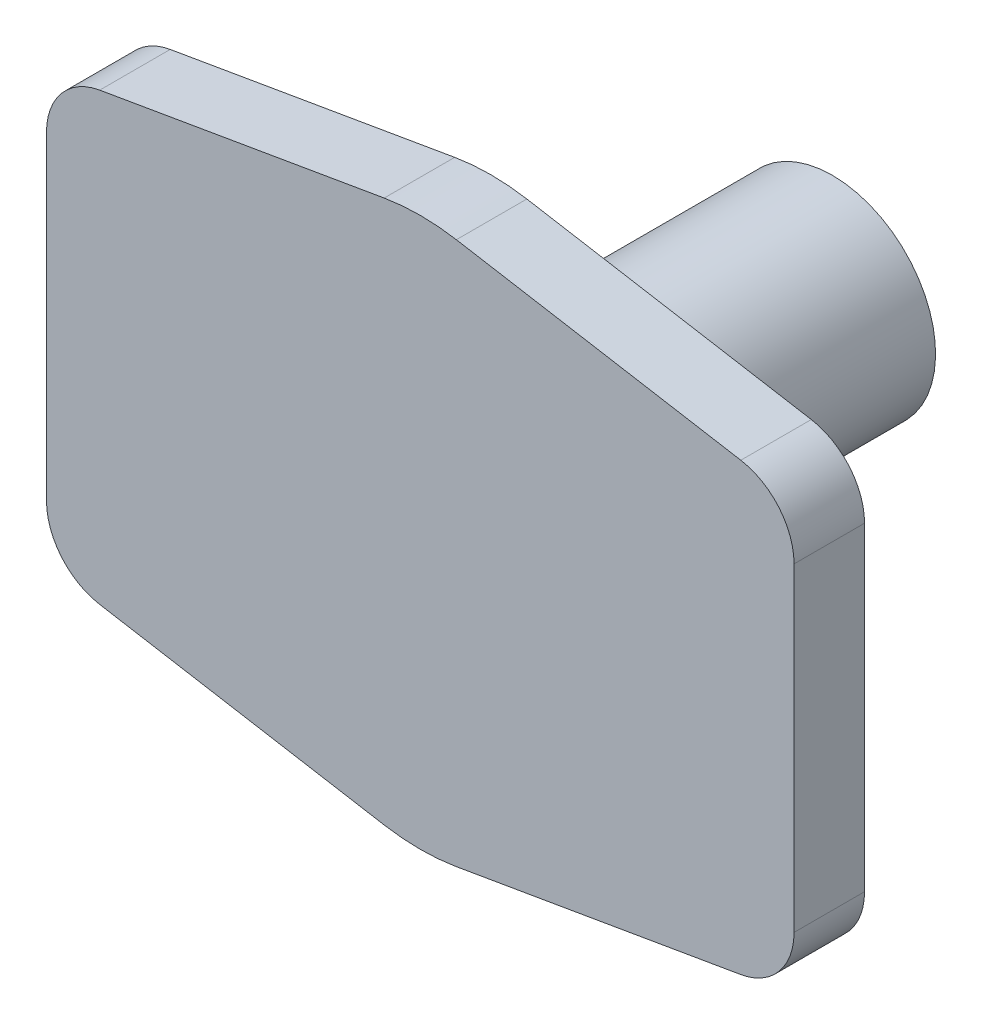
ISO-10303-21;
HEADER;
FILE_DESCRIPTION(('STEP AP214'),'2;1');
FILE_NAME('part.step','',(''),(''),'','','');
FILE_SCHEMA(('AUTOMOTIVE_DESIGN { 1 0 10303 214 1 1 1 1 }'));
ENDSEC;
DATA;
#1=APPLICATION_CONTEXT('core data for automotive mechanical design processes');
#2=APPLICATION_PROTOCOL_DEFINITION('international standard','automotive_design',2000,#1);
#3=PRODUCT_CONTEXT('',#1,'mechanical');
#4=PRODUCT('Part','Part','',(#3));
#5=PRODUCT_RELATED_PRODUCT_CATEGORY('part','',(#4));
#6=PRODUCT_DEFINITION_FORMATION('','',#4);
#7=PRODUCT_DEFINITION_CONTEXT('part definition',#1,'design');
#8=PRODUCT_DEFINITION('design','',#6,#7);
#9=PRODUCT_DEFINITION_SHAPE('','',#8);
#10=(LENGTH_UNIT() NAMED_UNIT(*) SI_UNIT(.MILLI.,.METRE.));
#11=(NAMED_UNIT(*) PLANE_ANGLE_UNIT() SI_UNIT($,.RADIAN.));
#12=(NAMED_UNIT(*) SI_UNIT($,.STERADIAN.) SOLID_ANGLE_UNIT());
#13=UNCERTAINTY_MEASURE_WITH_UNIT(LENGTH_MEASURE(1.E-05),#10,'distance_accuracy_value','');
#14=(GEOMETRIC_REPRESENTATION_CONTEXT(3) GLOBAL_UNCERTAINTY_ASSIGNED_CONTEXT((#13)) GLOBAL_UNIT_ASSIGNED_CONTEXT((#10,
#11,#12)) REPRESENTATION_CONTEXT('',''));
#15=CARTESIAN_POINT('',(0.,0.,0.));
#16=DIRECTION('',(0.,0.,1.));
#17=DIRECTION('',(1.,0.,0.));
#18=AXIS2_PLACEMENT_3D('',#15,#16,#17);
#19=CARTESIAN_POINT('',(0.,0.,-5.));
#20=DIRECTION('',(0.,0.,1.));
#21=DIRECTION('',(1.,0.,0.));
#22=AXIS2_PLACEMENT_3D('',#19,#20,#21);
#23=CYLINDRICAL_SURFACE('',#22,6.82);
#24=CARTESIAN_POINT('',(0.,0.,-1.9));
#25=DIRECTION('',(0.,0.,-1.));
#26=DIRECTION('',(-1.,0.,0.));
#27=AXIS2_PLACEMENT_3D('',#24,#25,#26);
#28=CIRCLE('',#27,6.82);
#29=CARTESIAN_POINT('',(-6.82,0.,-1.9));
#30=VERTEX_POINT('',#29);
#31=EDGE_CURVE('E259',#30,#30,#28,.F.);
#32=ORIENTED_EDGE('',*,*,#31,.F.);
#33=EDGE_LOOP('',(#32));
#34=FACE_BOUND('',#33,.T.);
#35=CARTESIAN_POINT('',(0.,0.,-5.));
#36=DIRECTION('',(0.,0.,1.));
#37=DIRECTION('',(0.,1.,0.));
#38=AXIS2_PLACEMENT_3D('',#35,#36,#37);
#39=CIRCLE('',#38,6.82);
#40=CARTESIAN_POINT('',(0.,6.82,-5.));
#41=VERTEX_POINT('',#40);
#42=EDGE_CURVE('E190',#41,#41,#39,.T.);
#43=ORIENTED_EDGE('',*,*,#42,.T.);
#44=EDGE_LOOP('',(#43));
#45=FACE_BOUND('',#44,.T.);
#46=ADVANCED_FACE('F15',(#34,#45),#23,.T.);
#47=CARTESIAN_POINT('',(0.,0.,-5.));
#48=DIRECTION('',(0.,0.,1.));
#49=DIRECTION('',(1.,0.,0.));
#50=AXIS2_PLACEMENT_3D('',#47,#48,#49);
#51=PLANE('',#50);
#52=CARTESIAN_POINT('',(0.,0.,-5.));
#53=DIRECTION('',(0.,0.,1.));
#54=DIRECTION('',(0.,1.,0.));
#55=AXIS2_PLACEMENT_3D('',#52,#53,#54);
#56=CIRCLE('',#55,4.825);
#57=CARTESIAN_POINT('',(0.,4.825,-5.));
#58=VERTEX_POINT('',#57);
#59=EDGE_CURVE('E324',#58,#58,#56,.T.);
#60=ORIENTED_EDGE('',*,*,#59,.T.);
#61=EDGE_LOOP('',(#60));
#62=FACE_BOUND('',#61,.T.);
#63=ORIENTED_EDGE('',*,*,#42,.F.);
#64=EDGE_LOOP('',(#63));
#65=FACE_BOUND('',#64,.T.);
#66=ADVANCED_FACE('F335',(#62,#65),#51,.F.);
#67=CARTESIAN_POINT('',(0.,0.,-16.));
#68=DIRECTION('',(0.,0.,1.));
#69=DIRECTION('',(1.,0.,0.));
#70=AXIS2_PLACEMENT_3D('',#67,#68,#69);
#71=CYLINDRICAL_SURFACE('',#70,4.825);
#72=CARTESIAN_POINT('',(0.,0.,-16.));
#73=DIRECTION('',(0.,0.,1.));
#74=DIRECTION('',(0.,1.,0.));
#75=AXIS2_PLACEMENT_3D('',#72,#73,#74);
#76=CIRCLE('',#75,4.825);
#77=CARTESIAN_POINT('',(0.,4.825,-16.));
#78=VERTEX_POINT('',#77);
#79=EDGE_CURVE('E459',#78,#78,#76,.T.);
#80=ORIENTED_EDGE('',*,*,#79,.T.);
#81=EDGE_LOOP('',(#80));
#82=FACE_BOUND('',#81,.T.);
#83=ORIENTED_EDGE('',*,*,#59,.F.);
#84=EDGE_LOOP('',(#83));
#85=FACE_BOUND('',#84,.T.);
#86=ADVANCED_FACE('F341',(#82,#85),#71,.T.);
#87=CARTESIAN_POINT('',(0.,0.,-16.));
#88=DIRECTION('',(0.,0.,1.));
#89=DIRECTION('',(1.,0.,0.));
#90=AXIS2_PLACEMENT_3D('',#87,#88,#89);
#91=PLANE('',#90);
#92=ORIENTED_EDGE('',*,*,#79,.F.);
#93=EDGE_LOOP('',(#92));
#94=FACE_BOUND('',#93,.T.);
#95=ADVANCED_FACE('F548',(#94),#91,.F.);
#96=CARTESIAN_POINT('',(7.,4.04145188432735,-1.9));
#97=DIRECTION('',(-1.,0.,0.));
#98=DIRECTION('',(0.,-1.,0.));
#99=AXIS2_PLACEMENT_3D('',#96,#97,#98);
#100=PLANE('',#99);
#101=DIRECTION('',(0.,-1.,0.));
#102=VECTOR('',#101,1.);
#103=CARTESIAN_POINT('',(7.,4.04145188432735,0.));
#104=LINE('',#103,#102);
#105=CARTESIAN_POINT('',(7.,3.40059308552686,0.));
#106=VERTEX_POINT('',#105);
#107=CARTESIAN_POINT('',(7.,-3.4005930855269,0.));
#108=VERTEX_POINT('',#107);
#109=EDGE_CURVE('E444',#106,#108,#104,.T.);
#110=ORIENTED_EDGE('',*,*,#109,.T.);
#111=DIRECTION('',(0.,0.,1.));
#112=VECTOR('',#111,1.);
#113=CARTESIAN_POINT('',(7.,-3.4005930855269,-1.9));
#114=LINE('',#113,#112);
#115=CARTESIAN_POINT('',(7.,-3.4005930855269,-1.9));
#116=VERTEX_POINT('',#115);
#117=EDGE_CURVE('E276',#108,#116,#114,.F.);
#118=ORIENTED_EDGE('',*,*,#117,.T.);
#119=DIRECTION('',(0.,-1.,0.));
#120=VECTOR('',#119,1.);
#121=CARTESIAN_POINT('',(7.,4.04145188432735,-1.9));
#122=LINE('',#121,#120);
#123=CARTESIAN_POINT('',(7.,3.40059308552686,-1.9));
#124=VERTEX_POINT('',#123);
#125=EDGE_CURVE('E435',#124,#116,#122,.T.);
#126=ORIENTED_EDGE('',*,*,#125,.F.);
#127=DIRECTION('',(0.,0.,1.));
#128=VECTOR('',#127,1.);
#129=CARTESIAN_POINT('',(7.,3.40059308552686,-1.9));
#130=LINE('',#129,#128);
#131=EDGE_CURVE('E262',#124,#106,#130,.T.);
#132=ORIENTED_EDGE('',*,*,#131,.T.);
#133=EDGE_LOOP('',(#110,#118,#126,#132));
#134=FACE_BOUND('',#133,.T.);
#135=ADVANCED_FACE('F545',(#134),#100,.F.);
#136=CARTESIAN_POINT('',(7.,-4.04145188432738,-1.9));
#137=DIRECTION('',(-0.5,0.866025403784439,0.));
#138=DIRECTION('',(-0.866025403784439,-0.5,0.));
#139=AXIS2_PLACEMENT_3D('',#136,#137,#138);
#140=PLANE('',#139);
#141=DIRECTION('',(-0.866025403784439,-0.5,0.));
#142=VECTOR('',#141,1.);
#143=CARTESIAN_POINT('',(7.,-4.04145188432738,0.));
#144=LINE('',#143,#142);
#145=CARTESIAN_POINT('',(6.445,-4.36188128372763,0.));
#146=VERTEX_POINT('',#145);
#147=CARTESIAN_POINT('',(0.555,-7.76247436925452,0.));
#148=VERTEX_POINT('',#147);
#149=EDGE_CURVE('E439',#146,#148,#144,.T.);
#150=ORIENTED_EDGE('',*,*,#149,.T.);
#151=DIRECTION('',(0.,0.,1.));
#152=VECTOR('',#151,1.);
#153=CARTESIAN_POINT('',(0.555,-7.76247436925452,-1.9));
#154=LINE('',#153,#152);
#155=CARTESIAN_POINT('',(0.555,-7.76247436925452,-1.9));
#156=VERTEX_POINT('',#155);
#157=EDGE_CURVE('E285',#148,#156,#154,.F.);
#158=ORIENTED_EDGE('',*,*,#157,.T.);
#159=DIRECTION('',(-0.866025403784439,-0.5,0.));
#160=VECTOR('',#159,1.);
#161=CARTESIAN_POINT('',(7.,-4.04145188432738,-1.9));
#162=LINE('',#161,#160);
#163=CARTESIAN_POINT('',(6.445,-4.36188128372763,-1.9));
#164=VERTEX_POINT('',#163);
#165=EDGE_CURVE('E431',#164,#156,#162,.T.);
#166=ORIENTED_EDGE('',*,*,#165,.F.);
#167=DIRECTION('',(0.,0.,1.));
#168=VECTOR('',#167,1.);
#169=CARTESIAN_POINT('',(6.445,-4.36188128372763,-1.9));
#170=LINE('',#169,#168);
#171=EDGE_CURVE('E273',#164,#146,#170,.T.);
#172=ORIENTED_EDGE('',*,*,#171,.T.);
#173=EDGE_LOOP('',(#150,#158,#166,#172));
#174=FACE_BOUND('',#173,.T.);
#175=ADVANCED_FACE('F521',(#174),#140,.F.);
#176=CARTESIAN_POINT('',(0.,-8.08290376865476,-1.9));
#177=DIRECTION('',(0.5,0.866025403784438,0.));
#178=DIRECTION('',(-0.866025403784439,0.5,0.));
#179=AXIS2_PLACEMENT_3D('',#176,#177,#178);
#180=PLANE('',#179);
#181=DIRECTION('',(-0.866025403784438,0.5,0.));
#182=VECTOR('',#181,1.);
#183=CARTESIAN_POINT('',(0.,-8.08290376865476,0.));
#184=LINE('',#183,#182);
#185=CARTESIAN_POINT('',(-0.555,-7.76247436925452,0.));
#186=VERTEX_POINT('',#185);
#187=CARTESIAN_POINT('',(-6.445,-4.36188128372762,0.));
#188=VERTEX_POINT('',#187);
#189=EDGE_CURVE('E443',#186,#188,#184,.T.);
#190=ORIENTED_EDGE('',*,*,#189,.T.);
#191=DIRECTION('',(0.,0.,1.));
#192=VECTOR('',#191,1.);
#193=CARTESIAN_POINT('',(-6.445,-4.36188128372762,-1.9));
#194=LINE('',#193,#192);
#195=CARTESIAN_POINT('',(-6.445,-4.36188128372762,-1.9));
#196=VERTEX_POINT('',#195);
#197=EDGE_CURVE('E294',#188,#196,#194,.F.);
#198=ORIENTED_EDGE('',*,*,#197,.T.);
#199=DIRECTION('',(-0.866025403784438,0.5,0.));
#200=VECTOR('',#199,1.);
#201=CARTESIAN_POINT('',(0.,-8.08290376865476,-1.9));
#202=LINE('',#201,#200);
#203=CARTESIAN_POINT('',(-0.555,-7.76247436925452,-1.9));
#204=VERTEX_POINT('',#203);
#205=EDGE_CURVE('E423',#204,#196,#202,.T.);
#206=ORIENTED_EDGE('',*,*,#205,.F.);
#207=DIRECTION('',(0.,0.,1.));
#208=VECTOR('',#207,1.);
#209=CARTESIAN_POINT('',(-0.555,-7.76247436925452,-1.9));
#210=LINE('',#209,#208);
#211=EDGE_CURVE('E282',#204,#186,#210,.T.);
#212=ORIENTED_EDGE('',*,*,#211,.T.);
#213=EDGE_LOOP('',(#190,#198,#206,#212));
#214=FACE_BOUND('',#213,.T.);
#215=ADVANCED_FACE('F528',(#214),#180,.F.);
#216=CARTESIAN_POINT('',(-7.,-4.04145188432738,-1.9));
#217=DIRECTION('',(1.,0.,0.));
#218=DIRECTION('',(0.,1.,0.));
#219=AXIS2_PLACEMENT_3D('',#216,#217,#218);
#220=PLANE('',#219);
#221=DIRECTION('',(0.,1.,0.));
#222=VECTOR('',#221,1.);
#223=CARTESIAN_POINT('',(-7.,-4.04145188432738,0.));
#224=LINE('',#223,#222);
#225=CARTESIAN_POINT('',(-7.,-3.40059308552689,0.));
#226=VERTEX_POINT('',#225);
#227=CARTESIAN_POINT('',(-7.,3.4005930855269,0.));
#228=VERTEX_POINT('',#227);
#229=EDGE_CURVE('E448',#226,#228,#224,.T.);
#230=ORIENTED_EDGE('',*,*,#229,.T.);
#231=DIRECTION('',(0.,0.,1.));
#232=VECTOR('',#231,1.);
#233=CARTESIAN_POINT('',(-7.,3.4005930855269,-1.9));
#234=LINE('',#233,#232);
#235=CARTESIAN_POINT('',(-7.,3.4005930855269,-1.9));
#236=VERTEX_POINT('',#235);
#237=EDGE_CURVE('E303',#228,#236,#234,.F.);
#238=ORIENTED_EDGE('',*,*,#237,.T.);
#239=DIRECTION('',(0.,1.,0.));
#240=VECTOR('',#239,1.);
#241=CARTESIAN_POINT('',(-7.,-4.04145188432738,-1.9));
#242=LINE('',#241,#240);
#243=CARTESIAN_POINT('',(-7.,-3.40059308552689,-1.9));
#244=VERTEX_POINT('',#243);
#245=EDGE_CURVE('E420',#244,#236,#242,.T.);
#246=ORIENTED_EDGE('',*,*,#245,.F.);
#247=DIRECTION('',(0.,0.,1.));
#248=VECTOR('',#247,1.);
#249=CARTESIAN_POINT('',(-7.,-3.40059308552689,-1.9));
#250=LINE('',#249,#248);
#251=EDGE_CURVE('E291',#244,#226,#250,.T.);
#252=ORIENTED_EDGE('',*,*,#251,.T.);
#253=EDGE_LOOP('',(#230,#238,#246,#252));
#254=FACE_BOUND('',#253,.T.);
#255=ADVANCED_FACE('F426',(#254),#220,.F.);
#256=CARTESIAN_POINT('',(-7.,4.04145188432738,-1.9));
#257=DIRECTION('',(0.5,-0.86602540378444,0.));
#258=DIRECTION('',(0.86602540378444,0.5,0.));
#259=AXIS2_PLACEMENT_3D('',#256,#257,#258);
#260=PLANE('',#259);
#261=DIRECTION('',(0.86602540378444,0.5,0.));
#262=VECTOR('',#261,1.);
#263=CARTESIAN_POINT('',(-7.,4.04145188432738,0.));
#264=LINE('',#263,#262);
#265=CARTESIAN_POINT('',(-6.445,4.36188128372763,0.));
#266=VERTEX_POINT('',#265);
#267=CARTESIAN_POINT('',(-0.55499999999998,7.76247436925451,0.));
#268=VERTEX_POINT('',#267);
#269=EDGE_CURVE('E451',#266,#268,#264,.T.);
#270=ORIENTED_EDGE('',*,*,#269,.T.);
#271=DIRECTION('',(0.,0.,1.));
#272=VECTOR('',#271,1.);
#273=CARTESIAN_POINT('',(-0.554999999999979,7.76247436925451,-1.9));
#274=LINE('',#273,#272);
#275=CARTESIAN_POINT('',(-0.55499999999998,7.76247436925451,-1.9));
#276=VERTEX_POINT('',#275);
#277=EDGE_CURVE('E35',#268,#276,#274,.F.);
#278=ORIENTED_EDGE('',*,*,#277,.T.);
#279=DIRECTION('',(0.86602540378444,0.5,0.));
#280=VECTOR('',#279,1.);
#281=CARTESIAN_POINT('',(-7.,4.04145188432738,-1.9));
#282=LINE('',#281,#280);
#283=CARTESIAN_POINT('',(-6.445,4.36188128372763,-1.9));
#284=VERTEX_POINT('',#283);
#285=EDGE_CURVE('E317',#284,#276,#282,.T.);
#286=ORIENTED_EDGE('',*,*,#285,.F.);
#287=DIRECTION('',(0.,0.,1.));
#288=VECTOR('',#287,1.);
#289=CARTESIAN_POINT('',(-6.445,4.36188128372763,-1.9));
#290=LINE('',#289,#288);
#291=EDGE_CURVE('E300',#284,#266,#290,.T.);
#292=ORIENTED_EDGE('',*,*,#291,.T.);
#293=EDGE_LOOP('',(#270,#278,#286,#292));
#294=FACE_BOUND('',#293,.T.);
#295=ADVANCED_FACE('F530',(#294),#260,.F.);
#296=CARTESIAN_POINT('',(0.,8.08290376865475,-1.9));
#297=DIRECTION('',(-0.5,-0.866025403784437,0.));
#298=DIRECTION('',(0.866025403784437,-0.5,0.));
#299=AXIS2_PLACEMENT_3D('',#296,#297,#298);
#300=PLANE('',#299);
#301=DIRECTION('',(0.866025403784437,-0.5,0.));
#302=VECTOR('',#301,1.);
#303=CARTESIAN_POINT('',(0.,8.08290376865475,-1.9));
#304=LINE('',#303,#302);
#305=CARTESIAN_POINT('',(0.555000000000021,7.76247436925451,-1.9));
#306=VERTEX_POINT('',#305);
#307=CARTESIAN_POINT('',(6.445,4.36188128372759,-1.9));
#308=VERTEX_POINT('',#307);
#309=EDGE_CURVE('E316',#306,#308,#304,.T.);
#310=ORIENTED_EDGE('',*,*,#309,.F.);
#311=DIRECTION('',(0.,0.,1.));
#312=VECTOR('',#311,1.);
#313=CARTESIAN_POINT('',(0.555000000000021,7.76247436925451,-1.9));
#314=LINE('',#313,#312);
#315=CARTESIAN_POINT('',(0.555000000000021,7.76247436925451,0.));
#316=VERTEX_POINT('',#315);
#317=EDGE_CURVE('E309',#306,#316,#314,.T.);
#318=ORIENTED_EDGE('',*,*,#317,.T.);
#319=DIRECTION('',(0.866025403784437,-0.5,0.));
#320=VECTOR('',#319,1.);
#321=CARTESIAN_POINT('',(0.,8.08290376865475,0.));
#322=LINE('',#321,#320);
#323=CARTESIAN_POINT('',(6.445,4.36188128372759,0.));
#324=VERTEX_POINT('',#323);
#325=EDGE_CURVE('E438',#316,#324,#322,.T.);
#326=ORIENTED_EDGE('',*,*,#325,.T.);
#327=DIRECTION('',(0.,0.,1.));
#328=VECTOR('',#327,1.);
#329=CARTESIAN_POINT('',(6.445,4.36188128372759,-1.9));
#330=LINE('',#329,#328);
#331=EDGE_CURVE('E265',#324,#308,#330,.F.);
#332=ORIENTED_EDGE('',*,*,#331,.T.);
#333=EDGE_LOOP('',(#310,#318,#326,#332));
#334=FACE_BOUND('',#333,.T.);
#335=ADVANCED_FACE('F321',(#334),#300,.F.);
#336=CARTESIAN_POINT('',(0.,0.,-1.9));
#337=DIRECTION('',(0.,0.,-1.));
#338=DIRECTION('',(-1.,0.,0.));
#339=AXIS2_PLACEMENT_3D('',#336,#337,#338);
#340=PLANE('',#339);
#341=ORIENTED_EDGE('',*,*,#31,.T.);
#342=EDGE_LOOP('',(#341));
#343=FACE_BOUND('',#342,.T.);
#344=ORIENTED_EDGE('',*,*,#285,.T.);
#345=CARTESIAN_POINT('',(0.,6.80118617105378,-1.9));
#346=DIRECTION('',(0.,0.,-1.));
#347=DIRECTION('',(-1.,0.,0.));
#348=AXIS2_PLACEMENT_3D('',#345,#346,#347);
#349=CIRCLE('',#348,1.11);
#350=EDGE_CURVE('E23',#276,#306,#349,.T.);
#351=ORIENTED_EDGE('',*,*,#350,.T.);
#352=ORIENTED_EDGE('',*,*,#309,.T.);
#353=CARTESIAN_POINT('',(5.89,3.40059308552687,-1.9));
#354=DIRECTION('',(0.,0.,-1.));
#355=DIRECTION('',(-1.,0.,0.));
#356=AXIS2_PLACEMENT_3D('',#353,#354,#355);
#357=CIRCLE('',#356,1.11);
#358=EDGE_CURVE('E268',#308,#124,#357,.T.);
#359=ORIENTED_EDGE('',*,*,#358,.T.);
#360=ORIENTED_EDGE('',*,*,#125,.T.);
#361=CARTESIAN_POINT('',(5.89,-3.4005930855269,-1.9));
#362=DIRECTION('',(0.,0.,-1.));
#363=DIRECTION('',(-1.,0.,0.));
#364=AXIS2_PLACEMENT_3D('',#361,#362,#363);
#365=CIRCLE('',#364,1.11);
#366=EDGE_CURVE('E278',#116,#164,#365,.T.);
#367=ORIENTED_EDGE('',*,*,#366,.T.);
#368=ORIENTED_EDGE('',*,*,#165,.T.);
#369=CARTESIAN_POINT('',(0.,-6.80118617105379,-1.9));
#370=DIRECTION('',(0.,0.,-1.));
#371=DIRECTION('',(-1.,0.,0.));
#372=AXIS2_PLACEMENT_3D('',#369,#370,#371);
#373=CIRCLE('',#372,1.11);
#374=EDGE_CURVE('E287',#156,#204,#373,.T.);
#375=ORIENTED_EDGE('',*,*,#374,.T.);
#376=ORIENTED_EDGE('',*,*,#205,.T.);
#377=CARTESIAN_POINT('',(-5.89,-3.40059308552689,-1.9));
#378=DIRECTION('',(0.,0.,-1.));
#379=DIRECTION('',(-1.,0.,0.));
#380=AXIS2_PLACEMENT_3D('',#377,#378,#379);
#381=CIRCLE('',#380,1.11);
#382=EDGE_CURVE('E296',#196,#244,#381,.T.);
#383=ORIENTED_EDGE('',*,*,#382,.T.);
#384=ORIENTED_EDGE('',*,*,#245,.T.);
#385=CARTESIAN_POINT('',(-5.89,3.4005930855269,-1.9));
#386=DIRECTION('',(0.,0.,-1.));
#387=DIRECTION('',(-1.,0.,0.));
#388=AXIS2_PLACEMENT_3D('',#385,#386,#387);
#389=CIRCLE('',#388,1.11);
#390=EDGE_CURVE('E305',#236,#284,#389,.T.);
#391=ORIENTED_EDGE('',*,*,#390,.T.);
#392=EDGE_LOOP('',(#344,#351,#352,#359,#360,#367,#368,#375,#376,#383,#384,#391));
#393=FACE_BOUND('',#392,.T.);
#394=ADVANCED_FACE('F315',(#343,#393),#340,.T.);
#395=CARTESIAN_POINT('',(0.,0.,3.3));
#396=DIRECTION('',(0.,0.,-1.));
#397=DIRECTION('',(-1.,0.,0.));
#398=AXIS2_PLACEMENT_3D('',#395,#396,#397);
#399=PLANE('',#398);
#400=DIRECTION('',(-0.985622254813267,0.168963815110846,0.));
#401=VECTOR('',#400,1.);
#402=CARTESIAN_POINT('',(17.5,10.,3.3));
#403=LINE('',#402,#401);
#404=CARTESIAN_POINT('',(15.0068914453326,10.427390037943,3.3));
#405=VERTEX_POINT('',#404);
#406=CARTESIAN_POINT('',(1.68963815110846,12.7103477455243,3.3));
#407=VERTEX_POINT('',#406);
#408=EDGE_CURVE('E472',#405,#407,#403,.T.);
#409=ORIENTED_EDGE('',*,*,#408,.T.);
#410=CARTESIAN_POINT('',(0.,2.8541251973916,3.3));
#411=DIRECTION('',(0.,0.,-1.));
#412=DIRECTION('',(-1.,0.,0.));
#413=AXIS2_PLACEMENT_3D('',#410,#411,#412);
#414=CIRCLE('',#413,10.);
#415=CARTESIAN_POINT('',(-1.68963815110846,12.7103477455243,3.3));
#416=VERTEX_POINT('',#415);
#417=EDGE_CURVE('E253',#407,#416,#414,.F.);
#418=ORIENTED_EDGE('',*,*,#417,.T.);
#419=DIRECTION('',(-0.985622254813267,-0.168963815110846,0.));
#420=VECTOR('',#419,1.);
#421=CARTESIAN_POINT('',(0.,13.,3.3));
#422=LINE('',#421,#420);
#423=CARTESIAN_POINT('',(-15.0068914453326,10.427390037943,3.3));
#424=VERTEX_POINT('',#423);
#425=EDGE_CURVE('E475',#416,#424,#422,.T.);
#426=ORIENTED_EDGE('',*,*,#425,.T.);
#427=CARTESIAN_POINT('',(-14.5,7.47052327350319,3.3));
#428=DIRECTION('',(0.,0.,-1.));
#429=DIRECTION('',(-1.,0.,0.));
#430=AXIS2_PLACEMENT_3D('',#427,#428,#429);
#431=CIRCLE('',#430,3.);
#432=CARTESIAN_POINT('',(-17.5,7.47052327350319,3.3));
#433=VERTEX_POINT('',#432);
#434=EDGE_CURVE('E226',#424,#433,#431,.F.);
#435=ORIENTED_EDGE('',*,*,#434,.T.);
#436=DIRECTION('',(0.,1.,0.));
#437=VECTOR('',#436,1.);
#438=CARTESIAN_POINT('',(-17.5,-13.,3.3));
#439=LINE('',#438,#437);
#440=CARTESIAN_POINT('',(-17.5,-7.47052327350319,3.3));
#441=VERTEX_POINT('',#440);
#442=EDGE_CURVE('E479',#441,#433,#439,.T.);
#443=ORIENTED_EDGE('',*,*,#442,.F.);
#444=CARTESIAN_POINT('',(-14.5,-7.47052327350319,3.3));
#445=DIRECTION('',(0.,0.,-1.));
#446=DIRECTION('',(-1.,0.,0.));
#447=AXIS2_PLACEMENT_3D('',#444,#445,#446);
#448=CIRCLE('',#447,3.);
#449=CARTESIAN_POINT('',(-15.0068914453326,-10.427390037943,3.3));
#450=VERTEX_POINT('',#449);
#451=EDGE_CURVE('E216',#441,#450,#448,.F.);
#452=ORIENTED_EDGE('',*,*,#451,.T.);
#453=DIRECTION('',(0.985622254813267,-0.168963815110846,0.));
#454=VECTOR('',#453,1.);
#455=CARTESIAN_POINT('',(-17.5,-10.,3.3));
#456=LINE('',#455,#454);
#457=CARTESIAN_POINT('',(-1.68963815110846,-12.7103477455243,3.3));
#458=VERTEX_POINT('',#457);
#459=EDGE_CURVE('E189',#450,#458,#456,.T.);
#460=ORIENTED_EDGE('',*,*,#459,.T.);
#461=CARTESIAN_POINT('',(0.,-2.8541251973916,3.3));
#462=DIRECTION('',(0.,0.,-1.));
#463=DIRECTION('',(-1.,0.,0.));
#464=AXIS2_PLACEMENT_3D('',#461,#462,#463);
#465=CIRCLE('',#464,10.);
#466=CARTESIAN_POINT('',(1.68963815110846,-12.7103477455243,3.3));
#467=VERTEX_POINT('',#466);
#468=EDGE_CURVE('E184',#458,#467,#465,.F.);
#469=ORIENTED_EDGE('',*,*,#468,.T.);
#470=DIRECTION('',(0.985622254813267,0.168963815110846,0.));
#471=VECTOR('',#470,1.);
#472=CARTESIAN_POINT('',(0.,-13.,3.3));
#473=LINE('',#472,#471);
#474=CARTESIAN_POINT('',(15.0068914453326,-10.427390037943,3.3));
#475=VERTEX_POINT('',#474);
#476=EDGE_CURVE('E176',#467,#475,#473,.T.);
#477=ORIENTED_EDGE('',*,*,#476,.T.);
#478=CARTESIAN_POINT('',(14.5,-7.47052327350319,3.3));
#479=DIRECTION('',(0.,0.,-1.));
#480=DIRECTION('',(-1.,0.,0.));
#481=AXIS2_PLACEMENT_3D('',#478,#479,#480);
#482=CIRCLE('',#481,3.);
#483=CARTESIAN_POINT('',(17.5,-7.47052327350319,3.3));
#484=VERTEX_POINT('',#483);
#485=EDGE_CURVE('E181',#475,#484,#482,.F.);
#486=ORIENTED_EDGE('',*,*,#485,.T.);
#487=DIRECTION('',(0.,-1.,0.));
#488=VECTOR('',#487,1.);
#489=CARTESIAN_POINT('',(17.5,13.,3.3));
#490=LINE('',#489,#488);
#491=CARTESIAN_POINT('',(17.5,7.47052327350319,3.3));
#492=VERTEX_POINT('',#491);
#493=EDGE_CURVE('E482',#492,#484,#490,.T.);
#494=ORIENTED_EDGE('',*,*,#493,.F.);
#495=CARTESIAN_POINT('',(14.5,7.47052327350319,3.3));
#496=DIRECTION('',(0.,0.,-1.));
#497=DIRECTION('',(-1.,0.,0.));
#498=AXIS2_PLACEMENT_3D('',#495,#496,#497);
#499=CIRCLE('',#498,3.);
#500=EDGE_CURVE('E235',#492,#405,#499,.F.);
#501=ORIENTED_EDGE('',*,*,#500,.T.);
#502=EDGE_LOOP('',(#409,#418,#426,#435,#443,#452,#460,#469,#477,#486,#494,#501));
#503=FACE_BOUND('',#502,.T.);
#504=ADVANCED_FACE('F179',(#503),#399,.F.);
#505=CARTESIAN_POINT('',(-14.5,7.47052327350319,-41.6431863578897));
#506=DIRECTION('',(0.,0.,1.));
#507=DIRECTION('',(1.,0.,0.));
#508=AXIS2_PLACEMENT_3D('',#505,#506,#507);
#509=CYLINDRICAL_SURFACE('',#508,3.);
#510=CARTESIAN_POINT('',(-14.5,7.47052327350319,0.));
#511=DIRECTION('',(0.,0.,-1.));
#512=DIRECTION('',(-1.,0.,0.));
#513=AXIS2_PLACEMENT_3D('',#510,#511,#512);
#514=CIRCLE('',#513,3.);
#515=CARTESIAN_POINT('',(-17.5,7.47052327350319,0.));
#516=VERTEX_POINT('',#515);
#517=CARTESIAN_POINT('',(-15.0068914453326,10.427390037943,0.));
#518=VERTEX_POINT('',#517);
#519=EDGE_CURVE('E230',#516,#518,#514,.T.);
#520=ORIENTED_EDGE('',*,*,#519,.F.);
#521=DIRECTION('',(0.,0.,1.));
#522=VECTOR('',#521,1.);
#523=CARTESIAN_POINT('',(-17.5,7.47052327350319,3.3));
#524=LINE('',#523,#522);
#525=EDGE_CURVE('E228',#433,#516,#524,.F.);
#526=ORIENTED_EDGE('',*,*,#525,.F.);
#527=ORIENTED_EDGE('',*,*,#434,.F.);
#528=DIRECTION('',(0.,0.,1.));
#529=VECTOR('',#528,1.);
#530=CARTESIAN_POINT('',(-15.0068914453326,10.427390037943,-41.6431863578897));
#531=LINE('',#530,#529);
#532=EDGE_CURVE('E223',#518,#424,#531,.T.);
#533=ORIENTED_EDGE('',*,*,#532,.F.);
#534=EDGE_LOOP('',(#520,#526,#527,#533));
#535=FACE_BOUND('',#534,.T.);
#536=ADVANCED_FACE('F369',(#535),#509,.T.);
#537=CARTESIAN_POINT('',(-17.5,-13.,3.3));
#538=DIRECTION('',(-1.,0.,0.));
#539=DIRECTION('',(0.,0.,1.));
#540=AXIS2_PLACEMENT_3D('',#537,#538,#539);
#541=PLANE('',#540);
#542=ORIENTED_EDGE('',*,*,#442,.T.);
#543=ORIENTED_EDGE('',*,*,#525,.T.);
#544=DIRECTION('',(0.,1.,0.));
#545=VECTOR('',#544,1.);
#546=CARTESIAN_POINT('',(-17.5,-13.,0.));
#547=LINE('',#546,#545);
#548=CARTESIAN_POINT('',(-17.5,-7.47052327350319,0.));
#549=VERTEX_POINT('',#548);
#550=EDGE_CURVE('E484',#549,#516,#547,.T.);
#551=ORIENTED_EDGE('',*,*,#550,.F.);
#552=DIRECTION('',(0.,0.,1.));
#553=VECTOR('',#552,1.);
#554=CARTESIAN_POINT('',(-17.5,-7.47052327350319,3.3));
#555=LINE('',#554,#553);
#556=EDGE_CURVE('E213',#549,#441,#555,.T.);
#557=ORIENTED_EDGE('',*,*,#556,.T.);
#558=EDGE_LOOP('',(#542,#543,#551,#557));
#559=FACE_BOUND('',#558,.T.);
#560=ADVANCED_FACE('F374',(#559),#541,.T.);
#561=CARTESIAN_POINT('',(-14.5,-7.47052327350319,3.3));
#562=DIRECTION('',(0.,0.,1.));
#563=DIRECTION('',(1.,0.,0.));
#564=AXIS2_PLACEMENT_3D('',#561,#562,#563);
#565=CYLINDRICAL_SURFACE('',#564,3.);
#566=CARTESIAN_POINT('',(-14.5,-7.47052327350319,0.));
#567=DIRECTION('',(0.,0.,-1.));
#568=DIRECTION('',(-1.,0.,0.));
#569=AXIS2_PLACEMENT_3D('',#566,#567,#568);
#570=CIRCLE('',#569,3.);
#571=CARTESIAN_POINT('',(-15.0068914453326,-10.427390037943,0.));
#572=VERTEX_POINT('',#571);
#573=EDGE_CURVE('E221',#572,#549,#570,.T.);
#574=ORIENTED_EDGE('',*,*,#573,.F.);
#575=DIRECTION('',(0.,0.,1.));
#576=VECTOR('',#575,1.);
#577=CARTESIAN_POINT('',(-15.0068914453326,-10.427390037943,-41.6431863578897));
#578=LINE('',#577,#576);
#579=EDGE_CURVE('E218',#450,#572,#578,.F.);
#580=ORIENTED_EDGE('',*,*,#579,.F.);
#581=ORIENTED_EDGE('',*,*,#451,.F.);
#582=ORIENTED_EDGE('',*,*,#556,.F.);
#583=EDGE_LOOP('',(#574,#580,#581,#582));
#584=FACE_BOUND('',#583,.T.);
#585=ADVANCED_FACE('F352',(#584),#565,.T.);
#586=CARTESIAN_POINT('',(-17.5,-10.,-41.6431863578897));
#587=DIRECTION('',(-0.168963815110846,-0.985622254813267,0.));
#588=DIRECTION('',(0.985622254813267,-0.168963815110846,0.));
#589=AXIS2_PLACEMENT_3D('',#586,#587,#588);
#590=PLANE('',#589);
#591=DIRECTION('',(-0.985622254813267,0.168963815110846,0.));
#592=VECTOR('',#591,1.);
#593=CARTESIAN_POINT('',(-2.16494845360825,-12.6288659793814,0.));
#594=LINE('',#593,#592);
#595=CARTESIAN_POINT('',(-1.68963815110846,-12.7103477455243,0.));
#596=VERTEX_POINT('',#595);
#597=EDGE_CURVE('E468',#596,#572,#594,.T.);
#598=ORIENTED_EDGE('',*,*,#597,.F.);
#599=DIRECTION('',(0.,0.,1.));
#600=VECTOR('',#599,1.);
#601=CARTESIAN_POINT('',(-1.68963815110846,-12.7103477455243,-41.6431863578897));
#602=LINE('',#601,#600);
#603=EDGE_CURVE('E242',#596,#458,#602,.T.);
#604=ORIENTED_EDGE('',*,*,#603,.T.);
#605=ORIENTED_EDGE('',*,*,#459,.F.);
#606=ORIENTED_EDGE('',*,*,#579,.T.);
#607=EDGE_LOOP('',(#598,#604,#605,#606));
#608=FACE_BOUND('',#607,.T.);
#609=ADVANCED_FACE('F348',(#608),#590,.T.);
#610=CARTESIAN_POINT('',(0.,-2.8541251973916,-41.6431863578897));
#611=DIRECTION('',(0.,0.,1.));
#612=DIRECTION('',(1.,0.,0.));
#613=AXIS2_PLACEMENT_3D('',#610,#611,#612);
#614=CYLINDRICAL_SURFACE('',#613,10.);
#615=CARTESIAN_POINT('',(0.,-2.8541251973916,0.));
#616=DIRECTION('',(0.,0.,-1.));
#617=DIRECTION('',(-1.,0.,0.));
#618=AXIS2_PLACEMENT_3D('',#615,#616,#617);
#619=CIRCLE('',#618,10.);
#620=CARTESIAN_POINT('',(1.68963815110846,-12.7103477455243,0.));
#621=VERTEX_POINT('',#620);
#622=EDGE_CURVE('E248',#621,#596,#619,.T.);
#623=ORIENTED_EDGE('',*,*,#622,.F.);
#624=DIRECTION('',(0.,0.,1.));
#625=VECTOR('',#624,1.);
#626=CARTESIAN_POINT('',(1.68963815110846,-12.7103477455243,-41.6431863578897));
#627=LINE('',#626,#625);
#628=EDGE_CURVE('E246',#467,#621,#627,.F.);
#629=ORIENTED_EDGE('',*,*,#628,.F.);
#630=ORIENTED_EDGE('',*,*,#468,.F.);
#631=ORIENTED_EDGE('',*,*,#603,.F.);
#632=EDGE_LOOP('',(#623,#629,#630,#631));
#633=FACE_BOUND('',#632,.T.);
#634=ADVANCED_FACE('F351',(#633),#614,.T.);
#635=CARTESIAN_POINT('',(0.,-13.,-41.6431863578897));
#636=DIRECTION('',(0.168963815110846,-0.985622254813267,0.));
#637=DIRECTION('',(0.985622254813267,0.168963815110846,0.));
#638=AXIS2_PLACEMENT_3D('',#635,#636,#637);
#639=PLANE('',#638);
#640=ORIENTED_EDGE('',*,*,#476,.F.);
#641=ORIENTED_EDGE('',*,*,#628,.T.);
#642=DIRECTION('',(-0.985622254813267,-0.168963815110846,0.));
#643=VECTOR('',#642,1.);
#644=CARTESIAN_POINT('',(2.16494845360825,-12.6288659793814,0.));
#645=LINE('',#644,#643);
#646=CARTESIAN_POINT('',(15.0068914453326,-10.427390037943,0.));
#647=VERTEX_POINT('',#646);
#648=EDGE_CURVE('E203',#647,#621,#645,.T.);
#649=ORIENTED_EDGE('',*,*,#648,.F.);
#650=DIRECTION('',(0.,0.,1.));
#651=VECTOR('',#650,1.);
#652=CARTESIAN_POINT('',(15.0068914453326,-10.427390037943,-41.6431863578897));
#653=LINE('',#652,#651);
#654=EDGE_CURVE('E196',#647,#475,#653,.T.);
#655=ORIENTED_EDGE('',*,*,#654,.T.);
#656=EDGE_LOOP('',(#640,#641,#649,#655));
#657=FACE_BOUND('',#656,.T.);
#658=ADVANCED_FACE('F201',(#657),#639,.T.);
#659=CARTESIAN_POINT('',(14.5,-7.47052327350319,-41.6431863578897));
#660=DIRECTION('',(0.,0.,1.));
#661=DIRECTION('',(1.,0.,0.));
#662=AXIS2_PLACEMENT_3D('',#659,#660,#661);
#663=CYLINDRICAL_SURFACE('',#662,3.);
#664=CARTESIAN_POINT('',(14.5,-7.47052327350319,0.));
#665=DIRECTION('',(0.,0.,-1.));
#666=DIRECTION('',(-1.,0.,0.));
#667=AXIS2_PLACEMENT_3D('',#664,#665,#666);
#668=CIRCLE('',#667,3.);
#669=CARTESIAN_POINT('',(17.5,-7.47052327350319,0.));
#670=VERTEX_POINT('',#669);
#671=EDGE_CURVE('E211',#670,#647,#668,.T.);
#672=ORIENTED_EDGE('',*,*,#671,.F.);
#673=DIRECTION('',(0.,0.,1.));
#674=VECTOR('',#673,1.);
#675=CARTESIAN_POINT('',(17.5,-7.47052327350319,3.3));
#676=LINE('',#675,#674);
#677=EDGE_CURVE('E198',#484,#670,#676,.F.);
#678=ORIENTED_EDGE('',*,*,#677,.F.);
#679=ORIENTED_EDGE('',*,*,#485,.F.);
#680=ORIENTED_EDGE('',*,*,#654,.F.);
#681=EDGE_LOOP('',(#672,#678,#679,#680));
#682=FACE_BOUND('',#681,.T.);
#683=ADVANCED_FACE('F195',(#682),#663,.T.);
#684=CARTESIAN_POINT('',(17.5,13.,3.3));
#685=DIRECTION('',(1.,0.,0.));
#686=DIRECTION('',(0.,0.,-1.));
#687=AXIS2_PLACEMENT_3D('',#684,#685,#686);
#688=PLANE('',#687);
#689=DIRECTION('',(0.,-1.,0.));
#690=VECTOR('',#689,1.);
#691=CARTESIAN_POINT('',(17.5,13.,0.));
#692=LINE('',#691,#690);
#693=CARTESIAN_POINT('',(17.5,7.47052327350319,0.));
#694=VERTEX_POINT('',#693);
#695=EDGE_CURVE('E478',#694,#670,#692,.T.);
#696=ORIENTED_EDGE('',*,*,#695,.F.);
#697=DIRECTION('',(0.,0.,1.));
#698=VECTOR('',#697,1.);
#699=CARTESIAN_POINT('',(17.5,7.47052327350319,3.3));
#700=LINE('',#699,#698);
#701=EDGE_CURVE('E232',#694,#492,#700,.T.);
#702=ORIENTED_EDGE('',*,*,#701,.T.);
#703=ORIENTED_EDGE('',*,*,#493,.T.);
#704=ORIENTED_EDGE('',*,*,#677,.T.);
#705=EDGE_LOOP('',(#696,#702,#703,#704));
#706=FACE_BOUND('',#705,.T.);
#707=ADVANCED_FACE('F378',(#706),#688,.T.);
#708=CARTESIAN_POINT('',(14.5,7.47052327350319,3.3));
#709=DIRECTION('',(0.,0.,1.));
#710=DIRECTION('',(1.,0.,0.));
#711=AXIS2_PLACEMENT_3D('',#708,#709,#710);
#712=CYLINDRICAL_SURFACE('',#711,3.);
#713=CARTESIAN_POINT('',(14.5,7.47052327350319,0.));
#714=DIRECTION('',(0.,0.,-1.));
#715=DIRECTION('',(-1.,0.,0.));
#716=AXIS2_PLACEMENT_3D('',#713,#714,#715);
#717=CIRCLE('',#716,3.);
#718=CARTESIAN_POINT('',(15.0068914453326,10.427390037943,0.));
#719=VERTEX_POINT('',#718);
#720=EDGE_CURVE('E240',#719,#694,#717,.T.);
#721=ORIENTED_EDGE('',*,*,#720,.F.);
#722=DIRECTION('',(0.,0.,1.));
#723=VECTOR('',#722,1.);
#724=CARTESIAN_POINT('',(15.0068914453326,10.427390037943,-41.6431863578897));
#725=LINE('',#724,#723);
#726=EDGE_CURVE('E237',#405,#719,#725,.F.);
#727=ORIENTED_EDGE('',*,*,#726,.F.);
#728=ORIENTED_EDGE('',*,*,#500,.F.);
#729=ORIENTED_EDGE('',*,*,#701,.F.);
#730=EDGE_LOOP('',(#721,#727,#728,#729));
#731=FACE_BOUND('',#730,.T.);
#732=ADVANCED_FACE('F365',(#731),#712,.T.);
#733=CARTESIAN_POINT('',(17.5,10.,-41.6431863578897));
#734=DIRECTION('',(0.168963815110846,0.985622254813267,0.));
#735=DIRECTION('',(-0.985622254813267,0.168963815110846,0.));
#736=AXIS2_PLACEMENT_3D('',#733,#734,#735);
#737=PLANE('',#736);
#738=DIRECTION('',(0.985622254813267,-0.168963815110846,0.));
#739=VECTOR('',#738,1.);
#740=CARTESIAN_POINT('',(2.16494845360825,12.6288659793814,0.));
#741=LINE('',#740,#739);
#742=CARTESIAN_POINT('',(1.68963815110846,12.7103477455243,0.));
#743=VERTEX_POINT('',#742);
#744=EDGE_CURVE('E204',#743,#719,#741,.T.);
#745=ORIENTED_EDGE('',*,*,#744,.F.);
#746=DIRECTION('',(0.,0.,1.));
#747=VECTOR('',#746,1.);
#748=CARTESIAN_POINT('',(1.68963815110846,12.7103477455243,-41.6431863578897));
#749=LINE('',#748,#747);
#750=EDGE_CURVE('E250',#743,#407,#749,.T.);
#751=ORIENTED_EDGE('',*,*,#750,.T.);
#752=ORIENTED_EDGE('',*,*,#408,.F.);
#753=ORIENTED_EDGE('',*,*,#726,.T.);
#754=EDGE_LOOP('',(#745,#751,#752,#753));
#755=FACE_BOUND('',#754,.T.);
#756=ADVANCED_FACE('F362',(#755),#737,.T.);
#757=CARTESIAN_POINT('',(0.,2.8541251973916,-41.6431863578897));
#758=DIRECTION('',(0.,0.,1.));
#759=DIRECTION('',(1.,0.,0.));
#760=AXIS2_PLACEMENT_3D('',#757,#758,#759);
#761=CYLINDRICAL_SURFACE('',#760,10.);
#762=CARTESIAN_POINT('',(0.,2.8541251973916,0.));
#763=DIRECTION('',(0.,0.,-1.));
#764=DIRECTION('',(-1.,0.,0.));
#765=AXIS2_PLACEMENT_3D('',#762,#763,#764);
#766=CIRCLE('',#765,10.);
#767=CARTESIAN_POINT('',(-1.68963815110846,12.7103477455243,0.));
#768=VERTEX_POINT('',#767);
#769=EDGE_CURVE('E257',#768,#743,#766,.T.);
#770=ORIENTED_EDGE('',*,*,#769,.F.);
#771=DIRECTION('',(0.,0.,1.));
#772=VECTOR('',#771,1.);
#773=CARTESIAN_POINT('',(-1.68963815110846,12.7103477455243,-41.6431863578897));
#774=LINE('',#773,#772);
#775=EDGE_CURVE('E255',#416,#768,#774,.F.);
#776=ORIENTED_EDGE('',*,*,#775,.F.);
#777=ORIENTED_EDGE('',*,*,#417,.F.);
#778=ORIENTED_EDGE('',*,*,#750,.F.);
#779=EDGE_LOOP('',(#770,#776,#777,#778));
#780=FACE_BOUND('',#779,.T.);
#781=ADVANCED_FACE('F360',(#780),#761,.T.);
#782=CARTESIAN_POINT('',(0.,13.,-41.6431863578897));
#783=DIRECTION('',(-0.168963815110846,0.985622254813267,0.));
#784=DIRECTION('',(-0.985622254813267,-0.168963815110846,0.));
#785=AXIS2_PLACEMENT_3D('',#782,#783,#784);
#786=PLANE('',#785);
#787=ORIENTED_EDGE('',*,*,#425,.F.);
#788=ORIENTED_EDGE('',*,*,#775,.T.);
#789=DIRECTION('',(0.985622254813267,0.168963815110846,0.));
#790=VECTOR('',#789,1.);
#791=CARTESIAN_POINT('',(-2.16494845360825,12.6288659793814,0.));
#792=LINE('',#791,#790);
#793=EDGE_CURVE('E206',#518,#768,#792,.T.);
#794=ORIENTED_EDGE('',*,*,#793,.F.);
#795=ORIENTED_EDGE('',*,*,#532,.T.);
#796=EDGE_LOOP('',(#787,#788,#794,#795));
#797=FACE_BOUND('',#796,.T.);
#798=ADVANCED_FACE('F356',(#797),#786,.T.);
#799=CARTESIAN_POINT('',(0.,0.,0.));
#800=DIRECTION('',(0.,0.,-1.));
#801=DIRECTION('',(-1.,0.,0.));
#802=AXIS2_PLACEMENT_3D('',#799,#800,#801);
#803=PLANE('',#802);
#804=ORIENTED_EDGE('',*,*,#793,.T.);
#805=ORIENTED_EDGE('',*,*,#769,.T.);
#806=ORIENTED_EDGE('',*,*,#744,.T.);
#807=ORIENTED_EDGE('',*,*,#720,.T.);
#808=ORIENTED_EDGE('',*,*,#695,.T.);
#809=ORIENTED_EDGE('',*,*,#671,.T.);
#810=ORIENTED_EDGE('',*,*,#648,.T.);
#811=ORIENTED_EDGE('',*,*,#622,.T.);
#812=ORIENTED_EDGE('',*,*,#597,.T.);
#813=ORIENTED_EDGE('',*,*,#573,.T.);
#814=ORIENTED_EDGE('',*,*,#550,.T.);
#815=ORIENTED_EDGE('',*,*,#519,.T.);
#816=EDGE_LOOP('',(#804,#805,#806,#807,#808,#809,#810,#811,#812,#813,#814,#815));
#817=FACE_BOUND('',#816,.T.);
#818=ORIENTED_EDGE('',*,*,#149,.F.);
#819=CARTESIAN_POINT('',(5.89,-3.4005930855269,0.));
#820=DIRECTION('',(0.,0.,-1.));
#821=DIRECTION('',(-1.,0.,0.));
#822=AXIS2_PLACEMENT_3D('',#819,#820,#821);
#823=CIRCLE('',#822,1.11);
#824=EDGE_CURVE('E280',#146,#108,#823,.F.);
#825=ORIENTED_EDGE('',*,*,#824,.T.);
#826=ORIENTED_EDGE('',*,*,#109,.F.);
#827=CARTESIAN_POINT('',(5.89,3.40059308552687,0.));
#828=DIRECTION('',(0.,0.,-1.));
#829=DIRECTION('',(-1.,0.,0.));
#830=AXIS2_PLACEMENT_3D('',#827,#828,#829);
#831=CIRCLE('',#830,1.11);
#832=EDGE_CURVE('E270',#106,#324,#831,.F.);
#833=ORIENTED_EDGE('',*,*,#832,.T.);
#834=ORIENTED_EDGE('',*,*,#325,.F.);
#835=CARTESIAN_POINT('',(0.,6.80118617105378,0.));
#836=DIRECTION('',(0.,0.,-1.));
#837=DIRECTION('',(-1.,0.,0.));
#838=AXIS2_PLACEMENT_3D('',#835,#836,#837);
#839=CIRCLE('',#838,1.11);
#840=EDGE_CURVE('E10',#316,#268,#839,.F.);
#841=ORIENTED_EDGE('',*,*,#840,.T.);
#842=ORIENTED_EDGE('',*,*,#269,.F.);
#843=CARTESIAN_POINT('',(-5.89,3.4005930855269,0.));
#844=DIRECTION('',(0.,0.,-1.));
#845=DIRECTION('',(-1.,0.,0.));
#846=AXIS2_PLACEMENT_3D('',#843,#844,#845);
#847=CIRCLE('',#846,1.11);
#848=EDGE_CURVE('E307',#266,#228,#847,.F.);
#849=ORIENTED_EDGE('',*,*,#848,.T.);
#850=ORIENTED_EDGE('',*,*,#229,.F.);
#851=CARTESIAN_POINT('',(-5.89,-3.40059308552689,0.));
#852=DIRECTION('',(0.,0.,-1.));
#853=DIRECTION('',(-1.,0.,0.));
#854=AXIS2_PLACEMENT_3D('',#851,#852,#853);
#855=CIRCLE('',#854,1.11);
#856=EDGE_CURVE('E298',#226,#188,#855,.F.);
#857=ORIENTED_EDGE('',*,*,#856,.T.);
#858=ORIENTED_EDGE('',*,*,#189,.F.);
#859=CARTESIAN_POINT('',(0.,-6.80118617105379,0.));
#860=DIRECTION('',(0.,0.,-1.));
#861=DIRECTION('',(-1.,0.,0.));
#862=AXIS2_PLACEMENT_3D('',#859,#860,#861);
#863=CIRCLE('',#862,1.11);
#864=EDGE_CURVE('E289',#186,#148,#863,.F.);
#865=ORIENTED_EDGE('',*,*,#864,.T.);
#866=EDGE_LOOP('',(#818,#825,#826,#833,#834,#841,#842,#849,#850,#857,#858,#865));
#867=FACE_BOUND('',#866,.T.);
#868=ADVANCED_FACE('F359',(#817,#867),#803,.T.);
#869=CARTESIAN_POINT('',(5.89,3.40059308552687,-1.9));
#870=DIRECTION('',(0.,0.,1.));
#871=DIRECTION('',(1.,0.,0.));
#872=AXIS2_PLACEMENT_3D('',#869,#870,#871);
#873=CYLINDRICAL_SURFACE('',#872,1.11);
#874=ORIENTED_EDGE('',*,*,#358,.F.);
#875=ORIENTED_EDGE('',*,*,#331,.F.);
#876=ORIENTED_EDGE('',*,*,#832,.F.);
#877=ORIENTED_EDGE('',*,*,#131,.F.);
#878=EDGE_LOOP('',(#874,#875,#876,#877));
#879=FACE_BOUND('',#878,.T.);
#880=ADVANCED_FACE('F372',(#879),#873,.T.);
#881=CARTESIAN_POINT('',(5.89,-3.4005930855269,-1.9));
#882=DIRECTION('',(0.,0.,1.));
#883=DIRECTION('',(1.,0.,0.));
#884=AXIS2_PLACEMENT_3D('',#881,#882,#883);
#885=CYLINDRICAL_SURFACE('',#884,1.11);
#886=ORIENTED_EDGE('',*,*,#366,.F.);
#887=ORIENTED_EDGE('',*,*,#117,.F.);
#888=ORIENTED_EDGE('',*,*,#824,.F.);
#889=ORIENTED_EDGE('',*,*,#171,.F.);
#890=EDGE_LOOP('',(#886,#887,#888,#889));
#891=FACE_BOUND('',#890,.T.);
#892=ADVANCED_FACE('F401',(#891),#885,.T.);
#893=CARTESIAN_POINT('',(0.,-6.80118617105379,-1.9));
#894=DIRECTION('',(0.,0.,1.));
#895=DIRECTION('',(1.,0.,0.));
#896=AXIS2_PLACEMENT_3D('',#893,#894,#895);
#897=CYLINDRICAL_SURFACE('',#896,1.11);
#898=ORIENTED_EDGE('',*,*,#374,.F.);
#899=ORIENTED_EDGE('',*,*,#157,.F.);
#900=ORIENTED_EDGE('',*,*,#864,.F.);
#901=ORIENTED_EDGE('',*,*,#211,.F.);
#902=EDGE_LOOP('',(#898,#899,#900,#901));
#903=FACE_BOUND('',#902,.T.);
#904=ADVANCED_FACE('F405',(#903),#897,.T.);
#905=CARTESIAN_POINT('',(-5.89,-3.40059308552689,-1.9));
#906=DIRECTION('',(0.,0.,1.));
#907=DIRECTION('',(1.,0.,0.));
#908=AXIS2_PLACEMENT_3D('',#905,#906,#907);
#909=CYLINDRICAL_SURFACE('',#908,1.11);
#910=ORIENTED_EDGE('',*,*,#382,.F.);
#911=ORIENTED_EDGE('',*,*,#197,.F.);
#912=ORIENTED_EDGE('',*,*,#856,.F.);
#913=ORIENTED_EDGE('',*,*,#251,.F.);
#914=EDGE_LOOP('',(#910,#911,#912,#913));
#915=FACE_BOUND('',#914,.T.);
#916=ADVANCED_FACE('F332',(#915),#909,.T.);
#917=CARTESIAN_POINT('',(-5.89,3.4005930855269,-1.9));
#918=DIRECTION('',(0.,0.,1.));
#919=DIRECTION('',(1.,0.,0.));
#920=AXIS2_PLACEMENT_3D('',#917,#918,#919);
#921=CYLINDRICAL_SURFACE('',#920,1.11);
#922=ORIENTED_EDGE('',*,*,#390,.F.);
#923=ORIENTED_EDGE('',*,*,#237,.F.);
#924=ORIENTED_EDGE('',*,*,#848,.F.);
#925=ORIENTED_EDGE('',*,*,#291,.F.);
#926=EDGE_LOOP('',(#922,#923,#924,#925));
#927=FACE_BOUND('',#926,.T.);
#928=ADVANCED_FACE('F327',(#927),#921,.T.);
#929=CARTESIAN_POINT('',(0.,6.80118617105378,-1.9));
#930=DIRECTION('',(0.,0.,1.));
#931=DIRECTION('',(1.,0.,0.));
#932=AXIS2_PLACEMENT_3D('',#929,#930,#931);
#933=CYLINDRICAL_SURFACE('',#932,1.11);
#934=ORIENTED_EDGE('',*,*,#350,.F.);
#935=ORIENTED_EDGE('',*,*,#277,.F.);
#936=ORIENTED_EDGE('',*,*,#840,.F.);
#937=ORIENTED_EDGE('',*,*,#317,.F.);
#938=EDGE_LOOP('',(#934,#935,#936,#937));
#939=FACE_BOUND('',#938,.T.);
#940=ADVANCED_FACE('F17',(#939),#933,.T.);
#941=CLOSED_SHELL('',(#46,#66,#86,#95,#135,#175,#215,#255,#295,#335,#394,#504,#536,#560,#585,
#609,#634,#658,#683,#707,#732,#756,#781,#798,#868,#880,#892,#904,#916,#928,#940));
#942=MANIFOLD_SOLID_BREP('B1',#941);
#943=ADVANCED_BREP_SHAPE_REPRESENTATION('',(#18,#942),#14);
#944=SHAPE_DEFINITION_REPRESENTATION(#9,#943);
ENDSEC;
END-ISO-10303-21;
